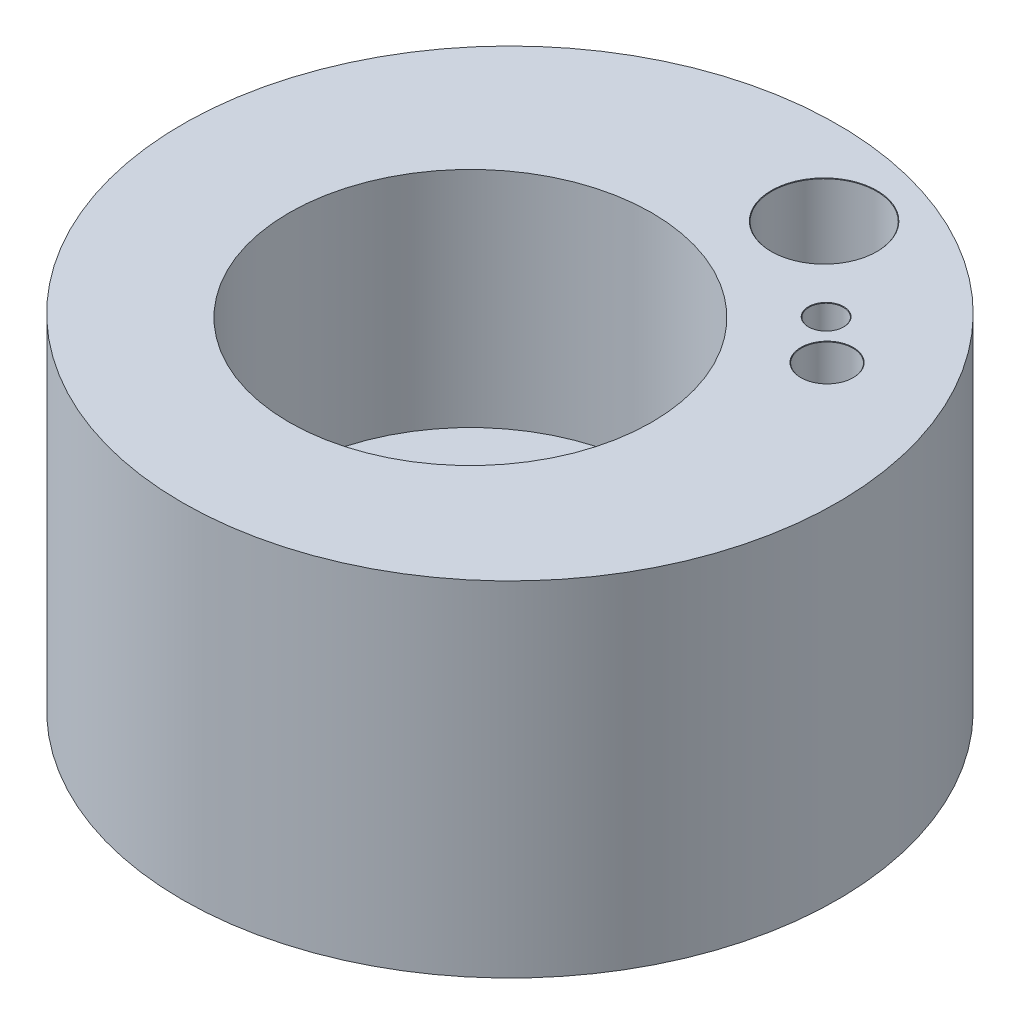
ISO-10303-21;
HEADER;
FILE_DESCRIPTION(('STEP AP214'),'2;1');
FILE_NAME('part.step','',(''),(''),'','','');
FILE_SCHEMA(('AUTOMOTIVE_DESIGN { 1 0 10303 214 1 1 1 1 }'));
ENDSEC;
DATA;
#1=APPLICATION_CONTEXT('core data for automotive mechanical design processes');
#2=APPLICATION_PROTOCOL_DEFINITION('international standard','automotive_design',2000,#1);
#3=PRODUCT_CONTEXT('',#1,'mechanical');
#4=PRODUCT('Part','Part','',(#3));
#5=PRODUCT_RELATED_PRODUCT_CATEGORY('part','',(#4));
#6=PRODUCT_DEFINITION_FORMATION('','',#4);
#7=PRODUCT_DEFINITION_CONTEXT('part definition',#1,'design');
#8=PRODUCT_DEFINITION('design','',#6,#7);
#9=PRODUCT_DEFINITION_SHAPE('','',#8);
#10=(LENGTH_UNIT() NAMED_UNIT(*) SI_UNIT(.MILLI.,.METRE.));
#11=(NAMED_UNIT(*) PLANE_ANGLE_UNIT() SI_UNIT($,.RADIAN.));
#12=(NAMED_UNIT(*) SI_UNIT($,.STERADIAN.) SOLID_ANGLE_UNIT());
#13=UNCERTAINTY_MEASURE_WITH_UNIT(LENGTH_MEASURE(1.E-05),#10,'distance_accuracy_value','');
#14=(GEOMETRIC_REPRESENTATION_CONTEXT(3) GLOBAL_UNCERTAINTY_ASSIGNED_CONTEXT((#13)) GLOBAL_UNIT_ASSIGNED_CONTEXT((#10,
#11,#12)) REPRESENTATION_CONTEXT('',''));
#15=CARTESIAN_POINT('',(0.,0.,0.));
#16=DIRECTION('',(0.,0.,1.));
#17=DIRECTION('',(1.,0.,0.));
#18=AXIS2_PLACEMENT_3D('',#15,#16,#17);
#19=CARTESIAN_POINT('',(-0.946159787860333,0.,1.35125621509229));
#20=DIRECTION('',(0.,-1.,0.));
#21=DIRECTION('',(0.,0.,-1.));
#22=AXIS2_PLACEMENT_3D('',#19,#20,#21);
#23=CYLINDRICAL_SURFACE('',#22,2.99999999999999);
#24=CARTESIAN_POINT('',(-0.946159787860333,0.0249999999999972,1.35125621509229));
#25=DIRECTION('',(0.,-1.,0.));
#26=DIRECTION('',(0.,0.,-1.));
#27=AXIS2_PLACEMENT_3D('',#24,#25,#26);
#28=CIRCLE('',#27,3.);
#29=CARTESIAN_POINT('',(-0.946159787860333,0.0249999999999972,-1.6487437849077));
#30=VERTEX_POINT('',#29);
#31=EDGE_CURVE('E288',#30,#30,#28,.T.);
#32=ORIENTED_EDGE('',*,*,#31,.T.);
#33=EDGE_LOOP('',(#32));
#34=FACE_BOUND('',#33,.T.);
#35=CARTESIAN_POINT('',(-0.946159787860333,7.,1.35125621509229));
#36=DIRECTION('',(0.,1.,0.));
#37=DIRECTION('',(0.,0.,1.));
#38=AXIS2_PLACEMENT_3D('',#35,#36,#37);
#39=CIRCLE('',#38,2.99999999999999);
#40=CARTESIAN_POINT('',(-0.946159787860333,7.,4.35125621509229));
#41=VERTEX_POINT('',#40);
#42=EDGE_CURVE('E49',#41,#41,#39,.F.);
#43=ORIENTED_EDGE('',*,*,#42,.F.);
#44=EDGE_LOOP('',(#43));
#45=FACE_BOUND('',#44,.T.);
#46=ADVANCED_FACE('F45',(#34,#45),#23,.F.);
#47=CARTESIAN_POINT('',(0.,20.,0.));
#48=DIRECTION('',(0.,-1.,0.));
#49=DIRECTION('',(0.,0.,-1.));
#50=AXIS2_PLACEMENT_3D('',#47,#48,#49);
#51=CYLINDRICAL_SURFACE('',#50,19.05);
#52=CARTESIAN_POINT('',(0.,20.,0.));
#53=DIRECTION('',(0.,1.,0.));
#54=DIRECTION('',(0.,0.,1.));
#55=AXIS2_PLACEMENT_3D('',#52,#53,#54);
#56=CIRCLE('',#55,19.05);
#57=CARTESIAN_POINT('',(0.,20.,19.05));
#58=VERTEX_POINT('',#57);
#59=EDGE_CURVE('E12',#58,#58,#56,.T.);
#60=ORIENTED_EDGE('',*,*,#59,.F.);
#61=EDGE_LOOP('',(#60));
#62=FACE_BOUND('',#61,.T.);
#63=CARTESIAN_POINT('',(0.,0.,0.));
#64=DIRECTION('',(0.,1.,0.));
#65=DIRECTION('',(0.,0.,1.));
#66=AXIS2_PLACEMENT_3D('',#63,#64,#65);
#67=CIRCLE('',#66,19.05);
#68=CARTESIAN_POINT('',(0.,0.,19.05));
#69=VERTEX_POINT('',#68);
#70=EDGE_CURVE('E55',#69,#69,#67,.T.);
#71=ORIENTED_EDGE('',*,*,#70,.T.);
#72=EDGE_LOOP('',(#71));
#73=FACE_BOUND('',#72,.T.);
#74=ADVANCED_FACE('F47',(#62,#73),#51,.T.);
#75=CARTESIAN_POINT('',(0.,20.,0.));
#76=DIRECTION('',(0.,1.,0.));
#77=DIRECTION('',(0.,0.,1.));
#78=AXIS2_PLACEMENT_3D('',#75,#76,#77);
#79=PLANE('',#78);
#80=CARTESIAN_POINT('',(-0.946159787860333,20.,1.35125621509229));
#81=DIRECTION('',(0.,1.,0.));
#82=DIRECTION('',(0.,0.,1.));
#83=AXIS2_PLACEMENT_3D('',#80,#81,#82);
#84=CIRCLE('',#83,10.54735);
#85=CARTESIAN_POINT('',(-0.946159787860333,20.,11.8986062150923));
#86=VERTEX_POINT('',#85);
#87=EDGE_CURVE('E278',#86,#86,#84,.T.);
#88=ORIENTED_EDGE('',*,*,#87,.F.);
#89=EDGE_LOOP('',(#88));
#90=FACE_BOUND('',#89,.T.);
#91=CARTESIAN_POINT('',(11.6913429510897,20.,-6.75000000000033));
#92=DIRECTION('',(0.,1.,0.));
#93=DIRECTION('',(0.,0.,1.));
#94=AXIS2_PLACEMENT_3D('',#91,#92,#93);
#95=CIRCLE('',#94,1.525);
#96=CARTESIAN_POINT('',(11.6913429510897,20.,-5.22500000000033));
#97=VERTEX_POINT('',#96);
#98=EDGE_CURVE('E86',#97,#97,#95,.T.);
#99=ORIENTED_EDGE('',*,*,#98,.F.);
#100=EDGE_LOOP('',(#99));
#101=FACE_BOUND('',#100,.T.);
#102=CARTESIAN_POINT('',(9.35879804595412,20.,-9.02746224239336));
#103=DIRECTION('',(0.,1.,0.));
#104=DIRECTION('',(0.,0.,1.));
#105=AXIS2_PLACEMENT_3D('',#102,#103,#104);
#106=CIRCLE('',#105,1.025);
#107=CARTESIAN_POINT('',(9.35879804595412,20.,-8.00246224239336));
#108=VERTEX_POINT('',#107);
#109=EDGE_CURVE('E77',#108,#108,#106,.T.);
#110=ORIENTED_EDGE('',*,*,#109,.F.);
#111=EDGE_LOOP('',(#110));
#112=FACE_BOUND('',#111,.T.);
#113=CARTESIAN_POINT('',(4.48074641843632,20.,-13.7903194862799));
#114=DIRECTION('',(0.,1.,0.));
#115=DIRECTION('',(0.,0.,1.));
#116=AXIS2_PLACEMENT_3D('',#113,#114,#115);
#117=CIRCLE('',#116,3.075);
#118=CARTESIAN_POINT('',(4.48074641843632,20.,-10.7153194862799));
#119=VERTEX_POINT('',#118);
#120=EDGE_CURVE('E97',#119,#119,#117,.T.);
#121=ORIENTED_EDGE('',*,*,#120,.F.);
#122=EDGE_LOOP('',(#121));
#123=FACE_BOUND('',#122,.T.);
#124=ORIENTED_EDGE('',*,*,#59,.T.);
#125=EDGE_LOOP('',(#124));
#126=FACE_BOUND('',#125,.T.);
#127=ADVANCED_FACE('F116',(#90,#101,#112,#123,#126),#79,.T.);
#128=CARTESIAN_POINT('',(0.,0.,0.));
#129=DIRECTION('',(0.,1.,0.));
#130=DIRECTION('',(0.,0.,1.));
#131=AXIS2_PLACEMENT_3D('',#128,#129,#130);
#132=PLANE('',#131);
#133=CARTESIAN_POINT('',(-0.946159787860333,0.,1.35125621509229));
#134=DIRECTION('',(0.,-1.,0.));
#135=DIRECTION('',(0.,0.,-1.));
#136=AXIS2_PLACEMENT_3D('',#133,#134,#135);
#137=CIRCLE('',#136,3.025);
#138=CARTESIAN_POINT('',(-0.946159787860333,0.,-1.67374378490771));
#139=VERTEX_POINT('',#138);
#140=EDGE_CURVE('E284',#139,#139,#137,.T.);
#141=ORIENTED_EDGE('',*,*,#140,.F.);
#142=EDGE_LOOP('',(#141));
#143=FACE_BOUND('',#142,.T.);
#144=ORIENTED_EDGE('',*,*,#70,.F.);
#145=EDGE_LOOP('',(#144));
#146=FACE_BOUND('',#145,.T.);
#147=ADVANCED_FACE('F113',(#143,#146),#132,.F.);
#148=CARTESIAN_POINT('',(4.48074641843632,8.,-13.7903194862799));
#149=DIRECTION('',(0.,1.,0.));
#150=DIRECTION('',(0.,0.,1.));
#151=AXIS2_PLACEMENT_3D('',#148,#149,#150);
#152=CONICAL_SURFACE('',#151,3.05,1.02974425867665);
#153=CARTESIAN_POINT('',(4.48074641843632,6.16737511196594,-13.7903194862799));
#154=VERTEX_POINT('',#153);
#155=VERTEX_LOOP('',#154);
#156=FACE_BOUND('',#155,.T.);
#157=CARTESIAN_POINT('',(4.48074641843632,8.,-13.7903194862799));
#158=DIRECTION('',(0.,1.,0.));
#159=DIRECTION('',(0.,0.,1.));
#160=AXIS2_PLACEMENT_3D('',#157,#158,#159);
#161=CIRCLE('',#160,3.05);
#162=CARTESIAN_POINT('',(4.48074641843632,8.,-10.7403194862799));
#163=VERTEX_POINT('',#162);
#164=EDGE_CURVE('E105',#163,#163,#161,.T.);
#165=ORIENTED_EDGE('',*,*,#164,.T.);
#166=EDGE_LOOP('',(#165));
#167=FACE_BOUND('',#166,.T.);
#168=ADVANCED_FACE('F115',(#156,#167),#152,.F.);
#169=CARTESIAN_POINT('',(4.48074641843632,20.,-13.7903194862799));
#170=DIRECTION('',(0.,1.,0.));
#171=DIRECTION('',(0.,0.,1.));
#172=AXIS2_PLACEMENT_3D('',#169,#170,#171);
#173=CYLINDRICAL_SURFACE('',#172,3.05);
#174=ORIENTED_EDGE('',*,*,#164,.F.);
#175=EDGE_LOOP('',(#174));
#176=FACE_BOUND('',#175,.T.);
#177=CARTESIAN_POINT('',(4.48074641843632,19.975,-13.7903194862799));
#178=DIRECTION('',(0.,1.,0.));
#179=DIRECTION('',(0.,0.,1.));
#180=AXIS2_PLACEMENT_3D('',#177,#178,#179);
#181=CIRCLE('',#180,3.05);
#182=CARTESIAN_POINT('',(4.48074641843632,19.975,-10.7403194862799));
#183=VERTEX_POINT('',#182);
#184=EDGE_CURVE('E101',#183,#183,#181,.T.);
#185=ORIENTED_EDGE('',*,*,#184,.T.);
#186=EDGE_LOOP('',(#185));
#187=FACE_BOUND('',#186,.T.);
#188=ADVANCED_FACE('F122',(#176,#187),#173,.F.);
#189=CARTESIAN_POINT('',(4.48074641843632,20.,-13.7903194862799));
#190=DIRECTION('',(0.,1.,0.));
#191=DIRECTION('',(0.,0.,1.));
#192=AXIS2_PLACEMENT_3D('',#189,#190,#191);
#193=CONICAL_SURFACE('',#192,3.075,0.785398163397448);
#194=ORIENTED_EDGE('',*,*,#184,.F.);
#195=EDGE_LOOP('',(#194));
#196=FACE_BOUND('',#195,.T.);
#197=ORIENTED_EDGE('',*,*,#120,.T.);
#198=EDGE_LOOP('',(#197));
#199=FACE_BOUND('',#198,.T.);
#200=ADVANCED_FACE('F156',(#196,#199),#193,.F.);
#201=CARTESIAN_POINT('',(9.35879804595412,15.,-9.02746224239336));
#202=DIRECTION('',(0.,1.,0.));
#203=DIRECTION('',(0.,0.,1.));
#204=AXIS2_PLACEMENT_3D('',#201,#202,#203);
#205=CONICAL_SURFACE('',#204,0.999999999999999,1.02974425867665);
#206=CARTESIAN_POINT('',(9.35879804595412,14.3991393809724,-9.02746224239336));
#207=VERTEX_POINT('',#206);
#208=VERTEX_LOOP('',#207);
#209=FACE_BOUND('',#208,.T.);
#210=CARTESIAN_POINT('',(9.35879804595412,15.,-9.02746224239336));
#211=DIRECTION('',(0.,1.,0.));
#212=DIRECTION('',(0.,0.,1.));
#213=AXIS2_PLACEMENT_3D('',#210,#211,#212);
#214=CIRCLE('',#213,0.999999999999999);
#215=CARTESIAN_POINT('',(9.35879804595412,15.,-8.02746224239337));
#216=VERTEX_POINT('',#215);
#217=EDGE_CURVE('E93',#216,#216,#214,.T.);
#218=ORIENTED_EDGE('',*,*,#217,.T.);
#219=EDGE_LOOP('',(#218));
#220=FACE_BOUND('',#219,.T.);
#221=ADVANCED_FACE('F152',(#209,#220),#205,.F.);
#222=CARTESIAN_POINT('',(9.35879804595412,20.,-9.02746224239336));
#223=DIRECTION('',(0.,1.,0.));
#224=DIRECTION('',(0.,0.,1.));
#225=AXIS2_PLACEMENT_3D('',#222,#223,#224);
#226=CYLINDRICAL_SURFACE('',#225,0.999999999999999);
#227=ORIENTED_EDGE('',*,*,#217,.F.);
#228=EDGE_LOOP('',(#227));
#229=FACE_BOUND('',#228,.T.);
#230=CARTESIAN_POINT('',(9.35879804595412,19.975,-9.02746224239336));
#231=DIRECTION('',(0.,1.,0.));
#232=DIRECTION('',(0.,0.,1.));
#233=AXIS2_PLACEMENT_3D('',#230,#231,#232);
#234=CIRCLE('',#233,0.999999999999999);
#235=CARTESIAN_POINT('',(9.35879804595412,19.975,-8.02746224239337));
#236=VERTEX_POINT('',#235);
#237=EDGE_CURVE('E83',#236,#236,#234,.T.);
#238=ORIENTED_EDGE('',*,*,#237,.T.);
#239=EDGE_LOOP('',(#238));
#240=FACE_BOUND('',#239,.T.);
#241=ADVANCED_FACE('F148',(#229,#240),#226,.F.);
#242=CARTESIAN_POINT('',(9.35879804595412,20.,-9.02746224239336));
#243=DIRECTION('',(0.,1.,0.));
#244=DIRECTION('',(0.,0.,1.));
#245=AXIS2_PLACEMENT_3D('',#242,#243,#244);
#246=CONICAL_SURFACE('',#245,1.025,0.785398163397448);
#247=ORIENTED_EDGE('',*,*,#237,.F.);
#248=EDGE_LOOP('',(#247));
#249=FACE_BOUND('',#248,.T.);
#250=ORIENTED_EDGE('',*,*,#109,.T.);
#251=EDGE_LOOP('',(#250));
#252=FACE_BOUND('',#251,.T.);
#253=ADVANCED_FACE('F70',(#249,#252),#246,.F.);
#254=CARTESIAN_POINT('',(11.6913429510897,15.,-6.75000000000033));
#255=DIRECTION('',(0.,1.,0.));
#256=DIRECTION('',(0.,0.,1.));
#257=AXIS2_PLACEMENT_3D('',#254,#255,#256);
#258=CONICAL_SURFACE('',#257,1.5,1.02974425867665);
#259=CARTESIAN_POINT('',(11.6913429510897,14.0987090714587,-6.75000000000033));
#260=VERTEX_POINT('',#259);
#261=VERTEX_LOOP('',#260);
#262=FACE_BOUND('',#261,.T.);
#263=CARTESIAN_POINT('',(11.6913429510897,15.,-6.75000000000033));
#264=DIRECTION('',(0.,1.,0.));
#265=DIRECTION('',(0.,0.,1.));
#266=AXIS2_PLACEMENT_3D('',#263,#264,#265);
#267=CIRCLE('',#266,1.5);
#268=CARTESIAN_POINT('',(11.6913429510897,15.,-5.25000000000033));
#269=VERTEX_POINT('',#268);
#270=EDGE_CURVE('E74',#269,#269,#267,.T.);
#271=ORIENTED_EDGE('',*,*,#270,.T.);
#272=EDGE_LOOP('',(#271));
#273=FACE_BOUND('',#272,.T.);
#274=ADVANCED_FACE('F66',(#262,#273),#258,.F.);
#275=CARTESIAN_POINT('',(11.6913429510897,20.,-6.75000000000033));
#276=DIRECTION('',(0.,1.,0.));
#277=DIRECTION('',(0.,0.,1.));
#278=AXIS2_PLACEMENT_3D('',#275,#276,#277);
#279=CYLINDRICAL_SURFACE('',#278,1.5);
#280=ORIENTED_EDGE('',*,*,#270,.F.);
#281=EDGE_LOOP('',(#280));
#282=FACE_BOUND('',#281,.T.);
#283=CARTESIAN_POINT('',(11.6913429510897,19.975,-6.75000000000033));
#284=DIRECTION('',(0.,1.,0.));
#285=DIRECTION('',(0.,0.,1.));
#286=AXIS2_PLACEMENT_3D('',#283,#284,#285);
#287=CIRCLE('',#286,1.5);
#288=CARTESIAN_POINT('',(11.6913429510897,19.975,-5.25000000000033));
#289=VERTEX_POINT('',#288);
#290=EDGE_CURVE('E78',#289,#289,#287,.T.);
#291=ORIENTED_EDGE('',*,*,#290,.T.);
#292=EDGE_LOOP('',(#291));
#293=FACE_BOUND('',#292,.T.);
#294=ADVANCED_FACE('F69',(#282,#293),#279,.F.);
#295=CARTESIAN_POINT('',(11.6913429510897,20.,-6.75000000000033));
#296=DIRECTION('',(0.,1.,0.));
#297=DIRECTION('',(0.,0.,1.));
#298=AXIS2_PLACEMENT_3D('',#295,#296,#297);
#299=CONICAL_SURFACE('',#298,1.525,0.785398163397448);
#300=ORIENTED_EDGE('',*,*,#290,.F.);
#301=EDGE_LOOP('',(#300));
#302=FACE_BOUND('',#301,.T.);
#303=ORIENTED_EDGE('',*,*,#98,.T.);
#304=EDGE_LOOP('',(#303));
#305=FACE_BOUND('',#304,.T.);
#306=ADVANCED_FACE('F140',(#302,#305),#299,.F.);
#307=CARTESIAN_POINT('',(-0.946159787860333,0.,1.35125621509229));
#308=DIRECTION('',(0.,-1.,0.));
#309=DIRECTION('',(0.,0.,-1.));
#310=AXIS2_PLACEMENT_3D('',#307,#308,#309);
#311=CONICAL_SURFACE('',#310,3.025,0.78539816339757);
#312=ORIENTED_EDGE('',*,*,#31,.F.);
#313=EDGE_LOOP('',(#312));
#314=FACE_BOUND('',#313,.T.);
#315=ORIENTED_EDGE('',*,*,#140,.T.);
#316=EDGE_LOOP('',(#315));
#317=FACE_BOUND('',#316,.T.);
#318=ADVANCED_FACE('F138',(#314,#317),#311,.F.);
#319=CARTESIAN_POINT('',(0.,7.,0.));
#320=DIRECTION('',(0.,1.,0.));
#321=DIRECTION('',(0.,0.,1.));
#322=AXIS2_PLACEMENT_3D('',#319,#320,#321);
#323=PLANE('',#322);
#324=CARTESIAN_POINT('',(-0.946159787860333,7.,1.35125621509229));
#325=DIRECTION('',(0.,1.,0.));
#326=DIRECTION('',(0.,0.,1.));
#327=AXIS2_PLACEMENT_3D('',#324,#325,#326);
#328=CIRCLE('',#327,10.54735);
#329=CARTESIAN_POINT('',(-0.946159787860333,7.,11.8986062150923));
#330=VERTEX_POINT('',#329);
#331=EDGE_CURVE('E275',#330,#330,#328,.F.);
#332=ORIENTED_EDGE('',*,*,#331,.F.);
#333=EDGE_LOOP('',(#332));
#334=FACE_BOUND('',#333,.T.);
#335=ORIENTED_EDGE('',*,*,#42,.T.);
#336=EDGE_LOOP('',(#335));
#337=FACE_BOUND('',#336,.T.);
#338=ADVANCED_FACE('F209',(#334,#337),#323,.T.);
#339=CARTESIAN_POINT('',(-0.946159787860333,-29.8324108341917,1.35125621509229));
#340=DIRECTION('',(0.,1.,0.));
#341=DIRECTION('',(0.,0.,1.));
#342=AXIS2_PLACEMENT_3D('',#339,#340,#341);
#343=CYLINDRICAL_SURFACE('',#342,10.54735);
#344=ORIENTED_EDGE('',*,*,#331,.T.);
#345=EDGE_LOOP('',(#344));
#346=FACE_BOUND('',#345,.T.);
#347=ORIENTED_EDGE('',*,*,#87,.T.);
#348=EDGE_LOOP('',(#347));
#349=FACE_BOUND('',#348,.T.);
#350=ADVANCED_FACE('F216',(#346,#349),#343,.F.);
#351=CLOSED_SHELL('',(#46,#74,#127,#147,#168,#188,#200,#221,#241,#253,#274,#294,#306,#318,#338,#350));
#352=MANIFOLD_SOLID_BREP('B2',#351);
#353=ADVANCED_BREP_SHAPE_REPRESENTATION('',(#18,#352),#14);
#354=SHAPE_DEFINITION_REPRESENTATION(#9,#353);
ENDSEC;
END-ISO-10303-21;
